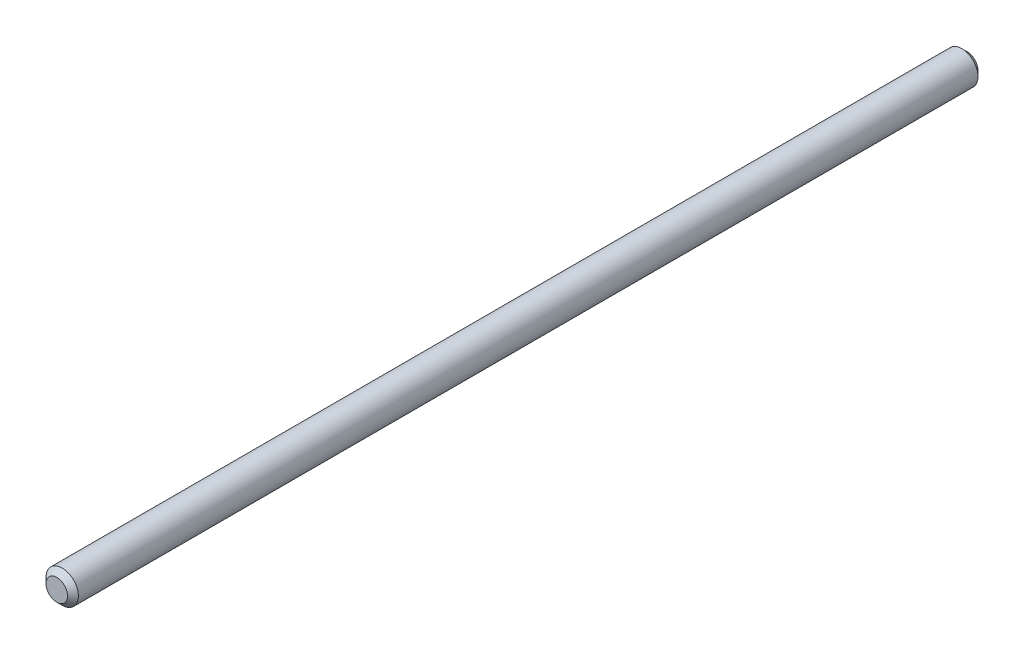
ISO-10303-21;
HEADER;
FILE_DESCRIPTION(('STEP AP214'),'2;1');
FILE_NAME('part.step','',(''),(''),'','','');
FILE_SCHEMA(('AUTOMOTIVE_DESIGN { 1 0 10303 214 1 1 1 1 }'));
ENDSEC;
DATA;
#1=APPLICATION_CONTEXT('core data for automotive mechanical design processes');
#2=APPLICATION_PROTOCOL_DEFINITION('international standard','automotive_design',2000,#1);
#3=PRODUCT_CONTEXT('',#1,'mechanical');
#4=PRODUCT('Part','Part','',(#3));
#5=PRODUCT_RELATED_PRODUCT_CATEGORY('part','',(#4));
#6=PRODUCT_DEFINITION_FORMATION('','',#4);
#7=PRODUCT_DEFINITION_CONTEXT('part definition',#1,'design');
#8=PRODUCT_DEFINITION('design','',#6,#7);
#9=PRODUCT_DEFINITION_SHAPE('','',#8);
#10=(LENGTH_UNIT() NAMED_UNIT(*) SI_UNIT(.MILLI.,.METRE.));
#11=(NAMED_UNIT(*) PLANE_ANGLE_UNIT() SI_UNIT($,.RADIAN.));
#12=(NAMED_UNIT(*) SI_UNIT($,.STERADIAN.) SOLID_ANGLE_UNIT());
#13=UNCERTAINTY_MEASURE_WITH_UNIT(LENGTH_MEASURE(1.E-05),#10,'distance_accuracy_value','');
#14=(GEOMETRIC_REPRESENTATION_CONTEXT(3) GLOBAL_UNCERTAINTY_ASSIGNED_CONTEXT((#13)) GLOBAL_UNIT_ASSIGNED_CONTEXT((#10,
#11,#12)) REPRESENTATION_CONTEXT('',''));
#15=CARTESIAN_POINT('',(0.,0.,0.));
#16=DIRECTION('',(0.,0.,1.));
#17=DIRECTION('',(1.,0.,0.));
#18=AXIS2_PLACEMENT_3D('',#15,#16,#17);
#19=CARTESIAN_POINT('',(0.,0.,84.4));
#20=DIRECTION('',(0.,0.,-1.));
#21=DIRECTION('',(-1.,0.,0.));
#22=AXIS2_PLACEMENT_3D('',#19,#20,#21);
#23=CYLINDRICAL_SURFACE('',#22,1.5);
#24=CARTESIAN_POINT('',(0.,0.,83.9));
#25=DIRECTION('',(0.,0.,1.));
#26=DIRECTION('',(1.,0.,0.));
#27=AXIS2_PLACEMENT_3D('',#24,#25,#26);
#28=CIRCLE('',#27,1.5);
#29=CARTESIAN_POINT('',(1.5,0.,83.9));
#30=VERTEX_POINT('',#29);
#31=EDGE_CURVE('E57',#30,#30,#28,.F.);
#32=ORIENTED_EDGE('',*,*,#31,.T.);
#33=EDGE_LOOP('',(#32));
#34=FACE_BOUND('',#33,.T.);
#35=CARTESIAN_POINT('',(0.,0.,0.5));
#36=DIRECTION('',(0.,0.,1.));
#37=DIRECTION('',(1.,0.,0.));
#38=AXIS2_PLACEMENT_3D('',#35,#36,#37);
#39=CIRCLE('',#38,1.5);
#40=CARTESIAN_POINT('',(1.5,0.,0.5));
#41=VERTEX_POINT('',#40);
#42=EDGE_CURVE('E63',#41,#41,#39,.T.);
#43=ORIENTED_EDGE('',*,*,#42,.T.);
#44=EDGE_LOOP('',(#43));
#45=FACE_BOUND('',#44,.T.);
#46=ADVANCED_FACE('F50',(#34,#45),#23,.T.);
#47=CARTESIAN_POINT('',(0.,0.,84.4));
#48=DIRECTION('',(0.,0.,1.));
#49=DIRECTION('',(1.,0.,0.));
#50=AXIS2_PLACEMENT_3D('',#47,#48,#49);
#51=PLANE('',#50);
#52=CARTESIAN_POINT('',(0.,0.,84.4));
#53=DIRECTION('',(0.,0.,1.));
#54=DIRECTION('',(1.,0.,0.));
#55=AXIS2_PLACEMENT_3D('',#52,#53,#54);
#56=CIRCLE('',#55,1.);
#57=CARTESIAN_POINT('',(1.,0.,84.4));
#58=VERTEX_POINT('',#57);
#59=EDGE_CURVE('E67',#58,#58,#56,.T.);
#60=ORIENTED_EDGE('',*,*,#59,.T.);
#61=EDGE_LOOP('',(#60));
#62=FACE_BOUND('',#61,.T.);
#63=ADVANCED_FACE('F75',(#62),#51,.T.);
#64=CARTESIAN_POINT('',(0.,0.,0.));
#65=DIRECTION('',(0.,0.,1.));
#66=DIRECTION('',(1.,0.,0.));
#67=AXIS2_PLACEMENT_3D('',#64,#65,#66);
#68=PLANE('',#67);
#69=CARTESIAN_POINT('',(0.,0.,0.));
#70=DIRECTION('',(0.,0.,1.));
#71=DIRECTION('',(1.,0.,0.));
#72=AXIS2_PLACEMENT_3D('',#69,#70,#71);
#73=CIRCLE('',#72,1.00000000000001);
#74=CARTESIAN_POINT('',(1.00000000000001,0.,0.));
#75=VERTEX_POINT('',#74);
#76=EDGE_CURVE('E10',#75,#75,#73,.F.);
#77=ORIENTED_EDGE('',*,*,#76,.T.);
#78=EDGE_LOOP('',(#77));
#79=FACE_BOUND('',#78,.T.);
#80=ADVANCED_FACE('F77',(#79),#68,.F.);
#81=CARTESIAN_POINT('',(0.,0.,84.4));
#82=DIRECTION('',(0.,0.,-1.));
#83=DIRECTION('',(-1.,0.,0.));
#84=AXIS2_PLACEMENT_3D('',#81,#82,#83);
#85=CONICAL_SURFACE('',#84,1.,0.785398163397447);
#86=ORIENTED_EDGE('',*,*,#31,.F.);
#87=EDGE_LOOP('',(#86));
#88=FACE_BOUND('',#87,.T.);
#89=ORIENTED_EDGE('',*,*,#59,.F.);
#90=EDGE_LOOP('',(#89));
#91=FACE_BOUND('',#90,.T.);
#92=ADVANCED_FACE('F73',(#88,#91),#85,.T.);
#93=CARTESIAN_POINT('',(0.,0.,0.5));
#94=DIRECTION('',(0.,0.,1.));
#95=DIRECTION('',(1.,0.,0.));
#96=AXIS2_PLACEMENT_3D('',#93,#94,#95);
#97=CONICAL_SURFACE('',#96,1.5,0.78539816339744);
#98=ORIENTED_EDGE('',*,*,#76,.F.);
#99=EDGE_LOOP('',(#98));
#100=FACE_BOUND('',#99,.T.);
#101=ORIENTED_EDGE('',*,*,#42,.F.);
#102=EDGE_LOOP('',(#101));
#103=FACE_BOUND('',#102,.T.);
#104=ADVANCED_FACE('F49',(#100,#103),#97,.T.);
#105=CLOSED_SHELL('',(#46,#63,#80,#92,#104));
#106=MANIFOLD_SOLID_BREP('B2',#105);
#107=ADVANCED_BREP_SHAPE_REPRESENTATION('',(#18,#106),#14);
#108=SHAPE_DEFINITION_REPRESENTATION(#9,#107);
ENDSEC;
END-ISO-10303-21;
